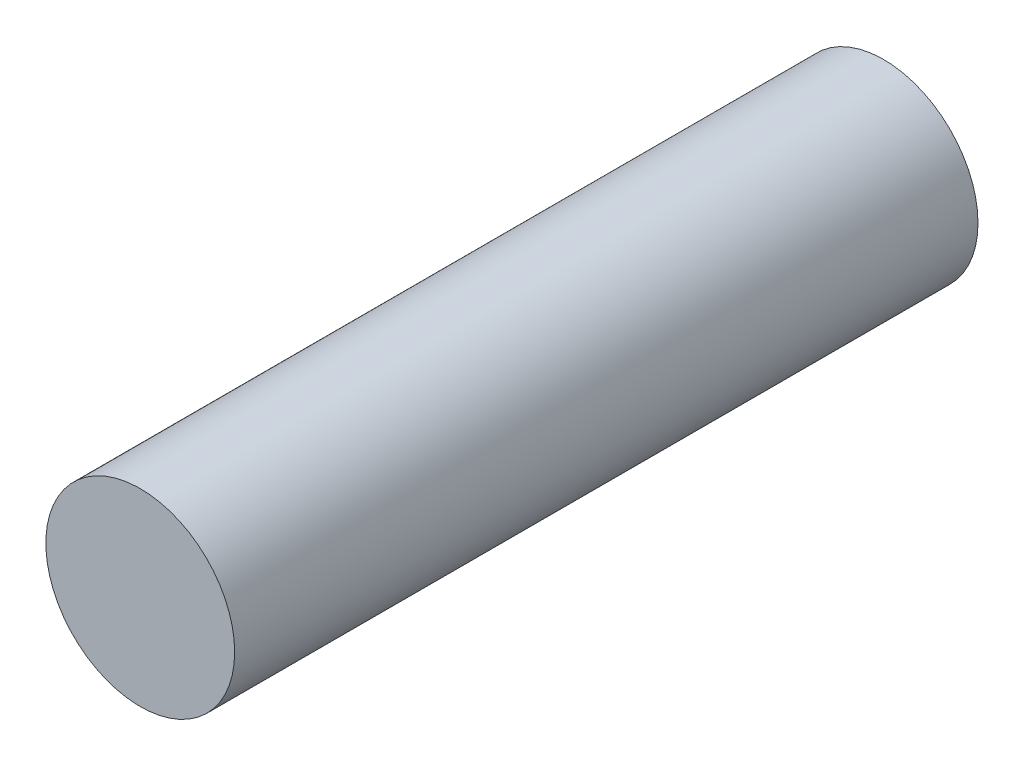
ISO-10303-21;
HEADER;
FILE_DESCRIPTION(('STEP AP214'),'2;1');
FILE_NAME('part.step','',(''),(''),'','','');
FILE_SCHEMA(('AUTOMOTIVE_DESIGN { 1 0 10303 214 1 1 1 1 }'));
ENDSEC;
DATA;
#1=APPLICATION_CONTEXT('core data for automotive mechanical design processes');
#2=APPLICATION_PROTOCOL_DEFINITION('international standard','automotive_design',2000,#1);
#3=PRODUCT_CONTEXT('',#1,'mechanical');
#4=PRODUCT('Part','Part','',(#3));
#5=PRODUCT_RELATED_PRODUCT_CATEGORY('part','',(#4));
#6=PRODUCT_DEFINITION_FORMATION('','',#4);
#7=PRODUCT_DEFINITION_CONTEXT('part definition',#1,'design');
#8=PRODUCT_DEFINITION('design','',#6,#7);
#9=PRODUCT_DEFINITION_SHAPE('','',#8);
#10=(LENGTH_UNIT() NAMED_UNIT(*) SI_UNIT(.MILLI.,.METRE.));
#11=(NAMED_UNIT(*) PLANE_ANGLE_UNIT() SI_UNIT($,.RADIAN.));
#12=(NAMED_UNIT(*) SI_UNIT($,.STERADIAN.) SOLID_ANGLE_UNIT());
#13=UNCERTAINTY_MEASURE_WITH_UNIT(LENGTH_MEASURE(1.E-05),#10,'distance_accuracy_value','');
#14=(GEOMETRIC_REPRESENTATION_CONTEXT(3) GLOBAL_UNCERTAINTY_ASSIGNED_CONTEXT((#13)) GLOBAL_UNIT_ASSIGNED_CONTEXT((#10,
#11,#12)) REPRESENTATION_CONTEXT('',''));
#15=CARTESIAN_POINT('',(0.,0.,0.));
#16=DIRECTION('',(0.,0.,1.));
#17=DIRECTION('',(1.,0.,0.));
#18=AXIS2_PLACEMENT_3D('',#15,#16,#17);
#19=CARTESIAN_POINT('',(0.,0.,50.));
#20=DIRECTION('',(0.,0.,-1.));
#21=DIRECTION('',(-1.,0.,0.));
#22=AXIS2_PLACEMENT_3D('',#19,#20,#21);
#23=CYLINDRICAL_SURFACE('',#22,6.35);
#24=CARTESIAN_POINT('',(0.,0.,50.));
#25=DIRECTION('',(0.,0.,1.));
#26=DIRECTION('',(1.,0.,0.));
#27=AXIS2_PLACEMENT_3D('',#24,#25,#26);
#28=CIRCLE('',#27,6.35);
#29=CARTESIAN_POINT('',(6.35,0.,50.));
#30=VERTEX_POINT('',#29);
#31=EDGE_CURVE('E10',#30,#30,#28,.T.);
#32=ORIENTED_EDGE('',*,*,#31,.F.);
#33=EDGE_LOOP('',(#32));
#34=FACE_BOUND('',#33,.T.);
#35=CARTESIAN_POINT('',(0.,0.,0.));
#36=DIRECTION('',(0.,0.,1.));
#37=DIRECTION('',(1.,0.,0.));
#38=AXIS2_PLACEMENT_3D('',#35,#36,#37);
#39=CIRCLE('',#38,6.35);
#40=CARTESIAN_POINT('',(6.35,0.,0.));
#41=VERTEX_POINT('',#40);
#42=EDGE_CURVE('E34',#41,#41,#39,.T.);
#43=ORIENTED_EDGE('',*,*,#42,.T.);
#44=EDGE_LOOP('',(#43));
#45=FACE_BOUND('',#44,.T.);
#46=ADVANCED_FACE('F31',(#34,#45),#23,.T.);
#47=CARTESIAN_POINT('',(0.,0.,50.));
#48=DIRECTION('',(0.,0.,1.));
#49=DIRECTION('',(1.,0.,0.));
#50=AXIS2_PLACEMENT_3D('',#47,#48,#49);
#51=PLANE('',#50);
#52=ORIENTED_EDGE('',*,*,#31,.T.);
#53=EDGE_LOOP('',(#52));
#54=FACE_BOUND('',#53,.T.);
#55=ADVANCED_FACE('F46',(#54),#51,.T.);
#56=CARTESIAN_POINT('',(0.,0.,0.));
#57=DIRECTION('',(0.,0.,1.));
#58=DIRECTION('',(1.,0.,0.));
#59=AXIS2_PLACEMENT_3D('',#56,#57,#58);
#60=PLANE('',#59);
#61=ORIENTED_EDGE('',*,*,#42,.F.);
#62=EDGE_LOOP('',(#61));
#63=FACE_BOUND('',#62,.T.);
#64=ADVANCED_FACE('F44',(#63),#60,.F.);
#65=CLOSED_SHELL('',(#46,#55,#64));
#66=MANIFOLD_SOLID_BREP('B2',#65);
#67=ADVANCED_BREP_SHAPE_REPRESENTATION('',(#18,#66),#14);
#68=SHAPE_DEFINITION_REPRESENTATION(#9,#67);
ENDSEC;
END-ISO-10303-21;
